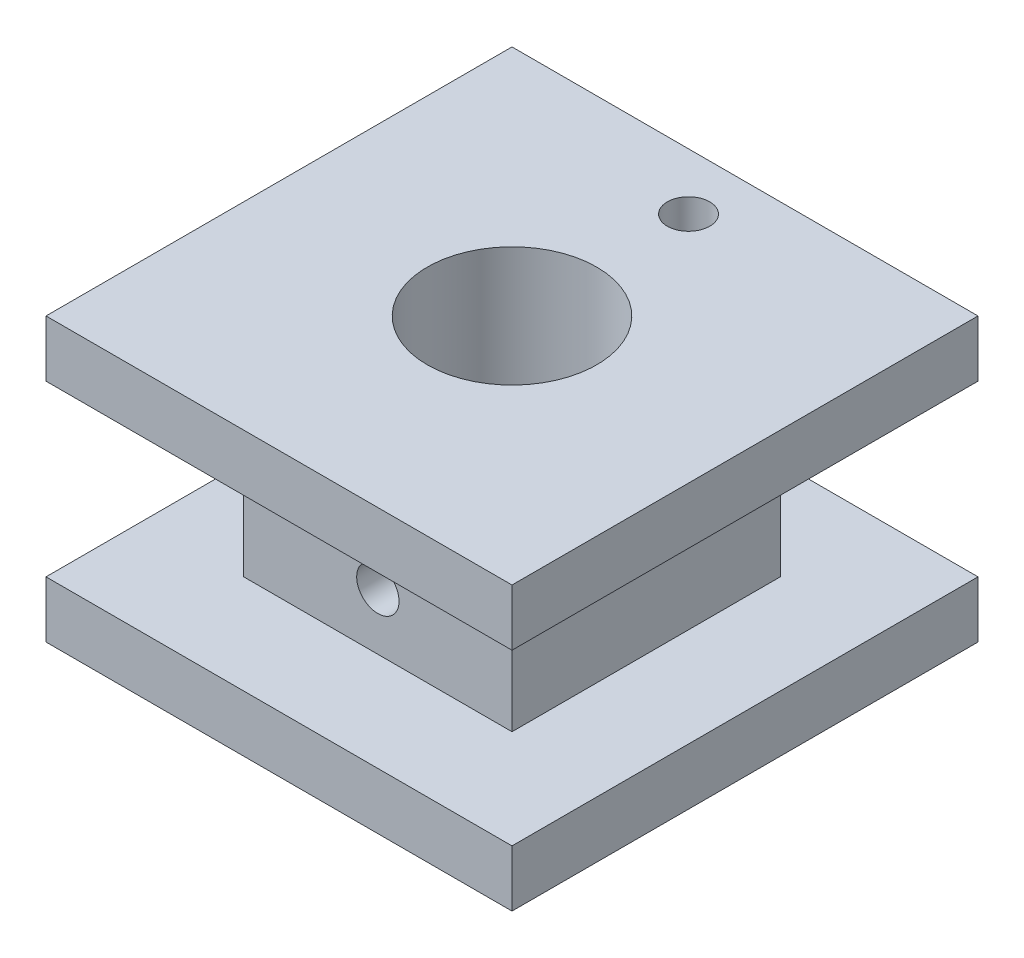
ISO-10303-21;
HEADER;
FILE_DESCRIPTION(('STEP AP214'),'2;1');
FILE_NAME('part.step','',(''),(''),'','','');
FILE_SCHEMA(('AUTOMOTIVE_DESIGN { 1 0 10303 214 1 1 1 1 }'));
ENDSEC;
DATA;
#1=APPLICATION_CONTEXT('core data for automotive mechanical design processes');
#2=APPLICATION_PROTOCOL_DEFINITION('international standard','automotive_design',2000,#1);
#3=PRODUCT_CONTEXT('',#1,'mechanical');
#4=PRODUCT('Part','Part','',(#3));
#5=PRODUCT_RELATED_PRODUCT_CATEGORY('part','',(#4));
#6=PRODUCT_DEFINITION_FORMATION('','',#4);
#7=PRODUCT_DEFINITION_CONTEXT('part definition',#1,'design');
#8=PRODUCT_DEFINITION('design','',#6,#7);
#9=PRODUCT_DEFINITION_SHAPE('','',#8);
#10=(LENGTH_UNIT() NAMED_UNIT(*) SI_UNIT(.MILLI.,.METRE.));
#11=(NAMED_UNIT(*) PLANE_ANGLE_UNIT() SI_UNIT($,.RADIAN.));
#12=(NAMED_UNIT(*) SI_UNIT($,.STERADIAN.) SOLID_ANGLE_UNIT());
#13=UNCERTAINTY_MEASURE_WITH_UNIT(LENGTH_MEASURE(1.E-05),#10,'distance_accuracy_value','');
#14=(GEOMETRIC_REPRESENTATION_CONTEXT(3) GLOBAL_UNCERTAINTY_ASSIGNED_CONTEXT((#13)) GLOBAL_UNIT_ASSIGNED_CONTEXT((#10,
#11,#12)) REPRESENTATION_CONTEXT('',''));
#15=CARTESIAN_POINT('',(0.,0.,0.));
#16=DIRECTION('',(0.,0.,1.));
#17=DIRECTION('',(1.,0.,0.));
#18=AXIS2_PLACEMENT_3D('',#15,#16,#17);
#19=CARTESIAN_POINT('',(-16.5,20.,16.5));
#20=DIRECTION('',(1.,0.,0.));
#21=DIRECTION('',(0.,0.,-1.));
#22=AXIS2_PLACEMENT_3D('',#19,#20,#21);
#23=PLANE('',#22);
#24=DIRECTION('',(0.,-1.,0.));
#25=VECTOR('',#24,1.);
#26=CARTESIAN_POINT('',(-16.5,20.,-16.5));
#27=LINE('',#26,#25);
#28=CARTESIAN_POINT('',(-16.5,20.,-16.5));
#29=VERTEX_POINT('',#28);
#30=CARTESIAN_POINT('',(-16.5,16.,-16.5));
#31=VERTEX_POINT('',#30);
#32=EDGE_CURVE('E210',#29,#31,#27,.T.);
#33=ORIENTED_EDGE('',*,*,#32,.T.);
#34=DIRECTION('',(0.,0.,1.));
#35=VECTOR('',#34,1.);
#36=CARTESIAN_POINT('',(-16.5,16.,9.5));
#37=LINE('',#36,#35);
#38=CARTESIAN_POINT('',(-16.5,16.,16.5));
#39=VERTEX_POINT('',#38);
#40=EDGE_CURVE('E178',#31,#39,#37,.T.);
#41=ORIENTED_EDGE('',*,*,#40,.T.);
#42=DIRECTION('',(0.,-1.,0.));
#43=VECTOR('',#42,1.);
#44=CARTESIAN_POINT('',(-16.5,20.,16.5));
#45=LINE('',#44,#43);
#46=CARTESIAN_POINT('',(-16.5,20.,16.5));
#47=VERTEX_POINT('',#46);
#48=EDGE_CURVE('E206',#47,#39,#45,.T.);
#49=ORIENTED_EDGE('',*,*,#48,.F.);
#50=DIRECTION('',(0.,0.,1.));
#51=VECTOR('',#50,1.);
#52=CARTESIAN_POINT('',(-16.5,20.,16.5));
#53=LINE('',#52,#51);
#54=EDGE_CURVE('E187',#29,#47,#53,.T.);
#55=ORIENTED_EDGE('',*,*,#54,.F.);
#56=EDGE_LOOP('',(#33,#41,#49,#55));
#57=FACE_BOUND('',#56,.T.);
#58=ADVANCED_FACE('F36',(#57),#23,.F.);
#59=DIRECTION('',(0.,0.,1.));
#60=VECTOR('',#59,1.);
#61=CARTESIAN_POINT('',(-16.5,4.,9.5));
#62=LINE('',#61,#60);
#63=CARTESIAN_POINT('',(-16.5,4.,-16.5));
#64=VERTEX_POINT('',#63);
#65=CARTESIAN_POINT('',(-16.5,4.,16.5));
#66=VERTEX_POINT('',#65);
#67=EDGE_CURVE('E176',#64,#66,#62,.T.);
#68=ORIENTED_EDGE('',*,*,#67,.F.);
#69=CARTESIAN_POINT('',(-16.5,0.,-16.5));
#70=VERTEX_POINT('',#69);
#71=EDGE_CURVE('E209',#64,#70,#27,.T.);
#72=ORIENTED_EDGE('',*,*,#71,.T.);
#73=DIRECTION('',(0.,0.,1.));
#74=VECTOR('',#73,1.);
#75=CARTESIAN_POINT('',(-16.5,0.,16.5));
#76=LINE('',#75,#74);
#77=CARTESIAN_POINT('',(-16.5,0.,16.5));
#78=VERTEX_POINT('',#77);
#79=EDGE_CURVE('E197',#70,#78,#76,.T.);
#80=ORIENTED_EDGE('',*,*,#79,.T.);
#81=EDGE_CURVE('E205',#66,#78,#45,.T.);
#82=ORIENTED_EDGE('',*,*,#81,.F.);
#83=EDGE_LOOP('',(#68,#72,#80,#82));
#84=FACE_BOUND('',#83,.T.);
#85=ADVANCED_FACE('F256',(#84),#23,.F.);
#86=CARTESIAN_POINT('',(16.5,20.,16.5));
#87=DIRECTION('',(-1.,0.,0.));
#88=DIRECTION('',(0.,0.,1.));
#89=AXIS2_PLACEMENT_3D('',#86,#87,#88);
#90=PLANE('',#89);
#91=DIRECTION('',(0.,-1.,0.));
#92=VECTOR('',#91,1.);
#93=CARTESIAN_POINT('',(16.5,20.,-16.5));
#94=LINE('',#93,#92);
#95=CARTESIAN_POINT('',(16.5,4.00000000000001,-16.5));
#96=VERTEX_POINT('',#95);
#97=CARTESIAN_POINT('',(16.5,0.,-16.5));
#98=VERTEX_POINT('',#97);
#99=EDGE_CURVE('E50',#96,#98,#94,.T.);
#100=ORIENTED_EDGE('',*,*,#99,.F.);
#101=DIRECTION('',(0.,0.,1.));
#102=VECTOR('',#101,1.);
#103=CARTESIAN_POINT('',(16.5,4.00000000000001,9.5));
#104=LINE('',#103,#102);
#105=CARTESIAN_POINT('',(16.5,4.00000000000001,16.5));
#106=VERTEX_POINT('',#105);
#107=EDGE_CURVE('E173',#96,#106,#104,.T.);
#108=ORIENTED_EDGE('',*,*,#107,.T.);
#109=DIRECTION('',(0.,-1.,0.));
#110=VECTOR('',#109,1.);
#111=CARTESIAN_POINT('',(16.5,20.,16.5));
#112=LINE('',#111,#110);
#113=CARTESIAN_POINT('',(16.5,0.,16.5));
#114=VERTEX_POINT('',#113);
#115=EDGE_CURVE('E191',#106,#114,#112,.T.);
#116=ORIENTED_EDGE('',*,*,#115,.T.);
#117=DIRECTION('',(0.,0.,-1.));
#118=VECTOR('',#117,1.);
#119=CARTESIAN_POINT('',(16.5,0.,16.5));
#120=LINE('',#119,#118);
#121=EDGE_CURVE('E175',#114,#98,#120,.T.);
#122=ORIENTED_EDGE('',*,*,#121,.T.);
#123=EDGE_LOOP('',(#100,#108,#116,#122));
#124=FACE_BOUND('',#123,.T.);
#125=ADVANCED_FACE('F262',(#124),#90,.F.);
#126=DIRECTION('',(0.,0.,1.));
#127=VECTOR('',#126,1.);
#128=CARTESIAN_POINT('',(16.5,16.,9.5));
#129=LINE('',#128,#127);
#130=CARTESIAN_POINT('',(16.5,16.,-16.5));
#131=VERTEX_POINT('',#130);
#132=CARTESIAN_POINT('',(16.5,16.,16.5));
#133=VERTEX_POINT('',#132);
#134=EDGE_CURVE('E168',#131,#133,#129,.T.);
#135=ORIENTED_EDGE('',*,*,#134,.F.);
#136=CARTESIAN_POINT('',(16.5,20.,-16.5));
#137=VERTEX_POINT('',#136);
#138=EDGE_CURVE('E11',#137,#131,#94,.T.);
#139=ORIENTED_EDGE('',*,*,#138,.F.);
#140=DIRECTION('',(0.,0.,-1.));
#141=VECTOR('',#140,1.);
#142=CARTESIAN_POINT('',(16.5,20.,16.5));
#143=LINE('',#142,#141);
#144=CARTESIAN_POINT('',(16.5,20.,16.5));
#145=VERTEX_POINT('',#144);
#146=EDGE_CURVE('E181',#145,#137,#143,.T.);
#147=ORIENTED_EDGE('',*,*,#146,.F.);
#148=EDGE_CURVE('E202',#145,#133,#112,.T.);
#149=ORIENTED_EDGE('',*,*,#148,.T.);
#150=EDGE_LOOP('',(#135,#139,#147,#149));
#151=FACE_BOUND('',#150,.T.);
#152=ADVANCED_FACE('F38',(#151),#90,.F.);
#153=CARTESIAN_POINT('',(-16.5,20.,-16.5));
#154=DIRECTION('',(0.,0.,1.));
#155=DIRECTION('',(1.,0.,0.));
#156=AXIS2_PLACEMENT_3D('',#153,#154,#155);
#157=PLANE('',#156);
#158=DIRECTION('',(-1.,0.,0.));
#159=VECTOR('',#158,1.);
#160=CARTESIAN_POINT('',(-16.5,16.,-16.5));
#161=LINE('',#160,#159);
#162=EDGE_CURVE('E150',#131,#31,#161,.T.);
#163=ORIENTED_EDGE('',*,*,#162,.T.);
#164=ORIENTED_EDGE('',*,*,#32,.F.);
#165=DIRECTION('',(-1.,0.,0.));
#166=VECTOR('',#165,1.);
#167=CARTESIAN_POINT('',(-16.5,20.,-16.5));
#168=LINE('',#167,#166);
#169=EDGE_CURVE('E184',#137,#29,#168,.T.);
#170=ORIENTED_EDGE('',*,*,#169,.F.);
#171=ORIENTED_EDGE('',*,*,#138,.T.);
#172=EDGE_LOOP('',(#163,#164,#170,#171));
#173=FACE_BOUND('',#172,.T.);
#174=ADVANCED_FACE('F267',(#173),#157,.F.);
#175=DIRECTION('',(1.,0.,0.));
#176=VECTOR('',#175,1.);
#177=CARTESIAN_POINT('',(-16.5,4.,-16.5));
#178=LINE('',#177,#176);
#179=EDGE_CURVE('E155',#64,#96,#178,.T.);
#180=ORIENTED_EDGE('',*,*,#179,.T.);
#181=ORIENTED_EDGE('',*,*,#99,.T.);
#182=DIRECTION('',(-1.,0.,0.));
#183=VECTOR('',#182,1.);
#184=CARTESIAN_POINT('',(-16.5,0.,-16.5));
#185=LINE('',#184,#183);
#186=EDGE_CURVE('E194',#98,#70,#185,.T.);
#187=ORIENTED_EDGE('',*,*,#186,.T.);
#188=ORIENTED_EDGE('',*,*,#71,.F.);
#189=EDGE_LOOP('',(#180,#181,#187,#188));
#190=FACE_BOUND('',#189,.T.);
#191=ADVANCED_FACE('F269',(#190),#157,.F.);
#192=CARTESIAN_POINT('',(-16.5,20.,16.5));
#193=DIRECTION('',(0.,0.,-1.));
#194=DIRECTION('',(-1.,0.,0.));
#195=AXIS2_PLACEMENT_3D('',#192,#193,#194);
#196=PLANE('',#195);
#197=ORIENTED_EDGE('',*,*,#115,.F.);
#198=DIRECTION('',(1.,0.,0.));
#199=VECTOR('',#198,1.);
#200=CARTESIAN_POINT('',(-16.5,4.,16.5));
#201=LINE('',#200,#199);
#202=EDGE_CURVE('E166',#66,#106,#201,.T.);
#203=ORIENTED_EDGE('',*,*,#202,.F.);
#204=ORIENTED_EDGE('',*,*,#81,.T.);
#205=DIRECTION('',(1.,0.,0.));
#206=VECTOR('',#205,1.);
#207=CARTESIAN_POINT('',(-16.5,0.,16.5));
#208=LINE('',#207,#206);
#209=EDGE_CURVE('E185',#78,#114,#208,.T.);
#210=ORIENTED_EDGE('',*,*,#209,.T.);
#211=EDGE_LOOP('',(#197,#203,#204,#210));
#212=FACE_BOUND('',#211,.T.);
#213=ADVANCED_FACE('F275',(#212),#196,.F.);
#214=ORIENTED_EDGE('',*,*,#48,.T.);
#215=DIRECTION('',(-1.,0.,0.));
#216=VECTOR('',#215,1.);
#217=CARTESIAN_POINT('',(-16.5,16.,16.5));
#218=LINE('',#217,#216);
#219=EDGE_CURVE('E152',#133,#39,#218,.T.);
#220=ORIENTED_EDGE('',*,*,#219,.F.);
#221=ORIENTED_EDGE('',*,*,#148,.F.);
#222=DIRECTION('',(1.,0.,0.));
#223=VECTOR('',#222,1.);
#224=CARTESIAN_POINT('',(-16.5,20.,16.5));
#225=LINE('',#224,#223);
#226=EDGE_CURVE('E189',#47,#145,#225,.T.);
#227=ORIENTED_EDGE('',*,*,#226,.F.);
#228=EDGE_LOOP('',(#214,#220,#221,#227));
#229=FACE_BOUND('',#228,.T.);
#230=ADVANCED_FACE('F265',(#229),#196,.F.);
#231=CARTESIAN_POINT('',(0.,20.,0.));
#232=DIRECTION('',(0.,-1.,0.));
#233=DIRECTION('',(0.,0.,-1.));
#234=AXIS2_PLACEMENT_3D('',#231,#232,#233);
#235=PLANE('',#234);
#236=CARTESIAN_POINT('',(0.,20.,-12.5));
#237=DIRECTION('',(0.,-1.,0.));
#238=DIRECTION('',(0.,0.,-1.));
#239=AXIS2_PLACEMENT_3D('',#236,#237,#238);
#240=CIRCLE('',#239,1.5);
#241=CARTESIAN_POINT('',(0.,20.,-14.));
#242=VERTEX_POINT('',#241);
#243=EDGE_CURVE('E214',#242,#242,#240,.T.);
#244=ORIENTED_EDGE('',*,*,#243,.T.);
#245=EDGE_LOOP('',(#244));
#246=FACE_BOUND('',#245,.T.);
#247=CARTESIAN_POINT('',(0.,20.,0.));
#248=DIRECTION('',(0.,1.,0.));
#249=DIRECTION('',(0.,0.,1.));
#250=AXIS2_PLACEMENT_3D('',#247,#248,#249);
#251=CIRCLE('',#250,6.);
#252=CARTESIAN_POINT('',(0.,20.,6.));
#253=VERTEX_POINT('',#252);
#254=EDGE_CURVE('E219',#253,#253,#251,.T.);
#255=ORIENTED_EDGE('',*,*,#254,.F.);
#256=EDGE_LOOP('',(#255));
#257=FACE_BOUND('',#256,.T.);
#258=ORIENTED_EDGE('',*,*,#146,.T.);
#259=ORIENTED_EDGE('',*,*,#169,.T.);
#260=ORIENTED_EDGE('',*,*,#54,.T.);
#261=ORIENTED_EDGE('',*,*,#226,.T.);
#262=EDGE_LOOP('',(#258,#259,#260,#261));
#263=FACE_BOUND('',#262,.T.);
#264=ADVANCED_FACE('F285',(#246,#257,#263),#235,.F.);
#265=CARTESIAN_POINT('',(0.,0.,0.));
#266=DIRECTION('',(0.,-1.,0.));
#267=DIRECTION('',(0.,0.,-1.));
#268=AXIS2_PLACEMENT_3D('',#265,#266,#267);
#269=PLANE('',#268);
#270=CARTESIAN_POINT('',(0.,0.,0.));
#271=DIRECTION('',(0.,1.,0.));
#272=DIRECTION('',(0.,0.,1.));
#273=AXIS2_PLACEMENT_3D('',#270,#271,#272);
#274=CIRCLE('',#273,6.);
#275=CARTESIAN_POINT('',(0.,0.,6.));
#276=VERTEX_POINT('',#275);
#277=EDGE_CURVE('E143',#276,#276,#274,.T.);
#278=ORIENTED_EDGE('',*,*,#277,.T.);
#279=EDGE_LOOP('',(#278));
#280=FACE_BOUND('',#279,.T.);
#281=ORIENTED_EDGE('',*,*,#121,.F.);
#282=ORIENTED_EDGE('',*,*,#209,.F.);
#283=ORIENTED_EDGE('',*,*,#79,.F.);
#284=ORIENTED_EDGE('',*,*,#186,.F.);
#285=EDGE_LOOP('',(#281,#282,#283,#284));
#286=FACE_BOUND('',#285,.T.);
#287=ADVANCED_FACE('F295',(#280,#286),#269,.T.);
#288=CARTESIAN_POINT('',(-16.5,4.,9.5));
#289=DIRECTION('',(0.,-1.,0.));
#290=DIRECTION('',(1.,0.,0.));
#291=AXIS2_PLACEMENT_3D('',#288,#289,#290);
#292=PLANE('',#291);
#293=ORIENTED_EDGE('',*,*,#67,.T.);
#294=ORIENTED_EDGE('',*,*,#202,.T.);
#295=ORIENTED_EDGE('',*,*,#107,.F.);
#296=ORIENTED_EDGE('',*,*,#179,.F.);
#297=EDGE_LOOP('',(#293,#294,#295,#296));
#298=FACE_BOUND('',#297,.T.);
#299=DIRECTION('',(1.,0.,0.));
#300=VECTOR('',#299,1.);
#301=CARTESIAN_POINT('',(-16.5,4.,9.5));
#302=LINE('',#301,#300);
#303=CARTESIAN_POINT('',(-9.5,4.,9.5));
#304=VERTEX_POINT('',#303);
#305=CARTESIAN_POINT('',(9.5,4.,9.5));
#306=VERTEX_POINT('',#305);
#307=EDGE_CURVE('E134',#304,#306,#302,.T.);
#308=ORIENTED_EDGE('',*,*,#307,.F.);
#309=DIRECTION('',(0.,0.,-1.));
#310=VECTOR('',#309,1.);
#311=CARTESIAN_POINT('',(-9.5,4.,9.5));
#312=LINE('',#311,#310);
#313=CARTESIAN_POINT('',(-9.5,4.,-9.5));
#314=VERTEX_POINT('',#313);
#315=EDGE_CURVE('E132',#304,#314,#312,.T.);
#316=ORIENTED_EDGE('',*,*,#315,.T.);
#317=DIRECTION('',(1.,0.,0.));
#318=VECTOR('',#317,1.);
#319=CARTESIAN_POINT('',(-16.5,4.,-9.5));
#320=LINE('',#319,#318);
#321=CARTESIAN_POINT('',(9.5,4.00000000000001,-9.5));
#322=VERTEX_POINT('',#321);
#323=EDGE_CURVE('E66',#314,#322,#320,.T.);
#324=ORIENTED_EDGE('',*,*,#323,.T.);
#325=DIRECTION('',(0.,0.,-1.));
#326=VECTOR('',#325,1.);
#327=CARTESIAN_POINT('',(9.5,4.,9.5));
#328=LINE('',#327,#326);
#329=EDGE_CURVE('E158',#306,#322,#328,.T.);
#330=ORIENTED_EDGE('',*,*,#329,.F.);
#331=EDGE_LOOP('',(#308,#316,#324,#330));
#332=FACE_BOUND('',#331,.T.);
#333=ADVANCED_FACE('F133',(#298,#332),#292,.F.);
#334=CARTESIAN_POINT('',(-16.5,16.,9.5));
#335=DIRECTION('',(0.,1.,0.));
#336=DIRECTION('',(-1.,0.,0.));
#337=AXIS2_PLACEMENT_3D('',#334,#335,#336);
#338=PLANE('',#337);
#339=CARTESIAN_POINT('',(0.,16.,-12.5));
#340=DIRECTION('',(0.,1.,0.));
#341=DIRECTION('',(-1.,0.,0.));
#342=AXIS2_PLACEMENT_3D('',#339,#340,#341);
#343=CIRCLE('',#342,1.5);
#344=CARTESIAN_POINT('',(-1.5,16.,-12.5));
#345=VERTEX_POINT('',#344);
#346=EDGE_CURVE('E212',#345,#345,#343,.T.);
#347=ORIENTED_EDGE('',*,*,#346,.T.);
#348=EDGE_LOOP('',(#347));
#349=FACE_BOUND('',#348,.T.);
#350=DIRECTION('',(0.,0.,1.));
#351=VECTOR('',#350,1.);
#352=CARTESIAN_POINT('',(-9.5,16.,9.5));
#353=LINE('',#352,#351);
#354=CARTESIAN_POINT('',(-9.5,16.,-9.5));
#355=VERTEX_POINT('',#354);
#356=CARTESIAN_POINT('',(-9.5,16.,9.5));
#357=VERTEX_POINT('',#356);
#358=EDGE_CURVE('E58',#355,#357,#353,.T.);
#359=ORIENTED_EDGE('',*,*,#358,.T.);
#360=DIRECTION('',(-1.,0.,0.));
#361=VECTOR('',#360,1.);
#362=CARTESIAN_POINT('',(-16.5,16.,9.5));
#363=LINE('',#362,#361);
#364=CARTESIAN_POINT('',(9.5,16.,9.5));
#365=VERTEX_POINT('',#364);
#366=EDGE_CURVE('E163',#365,#357,#363,.T.);
#367=ORIENTED_EDGE('',*,*,#366,.F.);
#368=DIRECTION('',(0.,0.,1.));
#369=VECTOR('',#368,1.);
#370=CARTESIAN_POINT('',(9.5,16.,9.5));
#371=LINE('',#370,#369);
#372=CARTESIAN_POINT('',(9.5,16.,-9.5));
#373=VERTEX_POINT('',#372);
#374=EDGE_CURVE('E234',#373,#365,#371,.T.);
#375=ORIENTED_EDGE('',*,*,#374,.F.);
#376=DIRECTION('',(-1.,0.,0.));
#377=VECTOR('',#376,1.);
#378=CARTESIAN_POINT('',(-16.5,16.,-9.5));
#379=LINE('',#378,#377);
#380=EDGE_CURVE('E149',#373,#355,#379,.T.);
#381=ORIENTED_EDGE('',*,*,#380,.T.);
#382=EDGE_LOOP('',(#359,#367,#375,#381));
#383=FACE_BOUND('',#382,.T.);
#384=ORIENTED_EDGE('',*,*,#219,.T.);
#385=ORIENTED_EDGE('',*,*,#40,.F.);
#386=ORIENTED_EDGE('',*,*,#162,.F.);
#387=ORIENTED_EDGE('',*,*,#134,.T.);
#388=EDGE_LOOP('',(#384,#385,#386,#387));
#389=FACE_BOUND('',#388,.T.);
#390=ADVANCED_FACE('F241',(#349,#383,#389),#338,.F.);
#391=CARTESIAN_POINT('',(0.,0.,9.5));
#392=DIRECTION('',(0.,0.,-1.));
#393=DIRECTION('',(-1.,0.,0.));
#394=AXIS2_PLACEMENT_3D('',#391,#392,#393);
#395=PLANE('',#394);
#396=CARTESIAN_POINT('',(0.,8.,9.5));
#397=DIRECTION('',(0.,0.,-1.));
#398=DIRECTION('',(-1.,0.,0.));
#399=AXIS2_PLACEMENT_3D('',#396,#397,#398);
#400=CIRCLE('',#399,1.5);
#401=CARTESIAN_POINT('',(-1.5,8.,9.5));
#402=VERTEX_POINT('',#401);
#403=EDGE_CURVE('E215',#402,#402,#400,.T.);
#404=ORIENTED_EDGE('',*,*,#403,.T.);
#405=EDGE_LOOP('',(#404));
#406=FACE_BOUND('',#405,.T.);
#407=ORIENTED_EDGE('',*,*,#366,.T.);
#408=DIRECTION('',(0.,-1.,0.));
#409=VECTOR('',#408,1.);
#410=CARTESIAN_POINT('',(-9.5,4.,9.5));
#411=LINE('',#410,#409);
#412=EDGE_CURVE('E136',#357,#304,#411,.T.);
#413=ORIENTED_EDGE('',*,*,#412,.T.);
#414=ORIENTED_EDGE('',*,*,#307,.T.);
#415=DIRECTION('',(0.,-1.,0.));
#416=VECTOR('',#415,1.);
#417=CARTESIAN_POINT('',(9.5,4.,9.5));
#418=LINE('',#417,#416);
#419=EDGE_CURVE('E235',#365,#306,#418,.T.);
#420=ORIENTED_EDGE('',*,*,#419,.F.);
#421=EDGE_LOOP('',(#407,#413,#414,#420));
#422=FACE_BOUND('',#421,.T.);
#423=ADVANCED_FACE('F245',(#406,#422),#395,.F.);
#424=CARTESIAN_POINT('',(0.,0.,-9.5));
#425=DIRECTION('',(0.,0.,1.));
#426=DIRECTION('',(-1.,0.,0.));
#427=AXIS2_PLACEMENT_3D('',#424,#425,#426);
#428=PLANE('',#427);
#429=ORIENTED_EDGE('',*,*,#323,.F.);
#430=DIRECTION('',(0.,1.,0.));
#431=VECTOR('',#430,1.);
#432=CARTESIAN_POINT('',(-9.5,4.,-9.5));
#433=LINE('',#432,#431);
#434=EDGE_CURVE('E137',#314,#355,#433,.T.);
#435=ORIENTED_EDGE('',*,*,#434,.T.);
#436=ORIENTED_EDGE('',*,*,#380,.F.);
#437=DIRECTION('',(0.,1.,0.));
#438=VECTOR('',#437,1.);
#439=CARTESIAN_POINT('',(9.5,4.,-9.5));
#440=LINE('',#439,#438);
#441=EDGE_CURVE('E148',#322,#373,#440,.T.);
#442=ORIENTED_EDGE('',*,*,#441,.F.);
#443=EDGE_LOOP('',(#429,#435,#436,#442));
#444=FACE_BOUND('',#443,.T.);
#445=ADVANCED_FACE('F146',(#444),#428,.F.);
#446=CARTESIAN_POINT('',(9.5,0.,0.));
#447=DIRECTION('',(-1.,0.,0.));
#448=DIRECTION('',(0.,0.,1.));
#449=AXIS2_PLACEMENT_3D('',#446,#447,#448);
#450=PLANE('',#449);
#451=ORIENTED_EDGE('',*,*,#441,.T.);
#452=ORIENTED_EDGE('',*,*,#374,.T.);
#453=ORIENTED_EDGE('',*,*,#419,.T.);
#454=ORIENTED_EDGE('',*,*,#329,.T.);
#455=EDGE_LOOP('',(#451,#452,#453,#454));
#456=FACE_BOUND('',#455,.T.);
#457=ADVANCED_FACE('F239',(#456),#450,.F.);
#458=CARTESIAN_POINT('',(-9.5,0.,0.));
#459=DIRECTION('',(1.,0.,0.));
#460=DIRECTION('',(0.,0.,1.));
#461=AXIS2_PLACEMENT_3D('',#458,#459,#460);
#462=PLANE('',#461);
#463=ORIENTED_EDGE('',*,*,#434,.F.);
#464=ORIENTED_EDGE('',*,*,#315,.F.);
#465=ORIENTED_EDGE('',*,*,#412,.F.);
#466=ORIENTED_EDGE('',*,*,#358,.F.);
#467=EDGE_LOOP('',(#463,#464,#465,#466));
#468=FACE_BOUND('',#467,.T.);
#469=ADVANCED_FACE('F139',(#468),#462,.F.);
#470=CARTESIAN_POINT('',(0.,0.,0.));
#471=DIRECTION('',(0.,1.,0.));
#472=DIRECTION('',(0.,0.,1.));
#473=AXIS2_PLACEMENT_3D('',#470,#471,#472);
#474=CYLINDRICAL_SURFACE('',#473,6.);
#475=CARTESIAN_POINT('',(0.,6.5,6.));
#476=CARTESIAN_POINT('',(0.0828760886697311,6.50000232573816,5.99999859868013));
#477=CARTESIAN_POINT('',(0.165778157830763,6.50689155077379,5.99826578131828));
#478=CARTESIAN_POINT('',(0.329206323770533,6.53422515130701,5.99152113829892));
#479=CARTESIAN_POINT('',(0.409731046870739,6.55467720953785,5.98650745419968));
#480=CARTESIAN_POINT('',(0.566020872182577,6.60843925346209,5.9737562633204));
#481=CARTESIAN_POINT('',(0.641791563430003,6.64173379871528,5.96602202842087));
#482=CARTESIAN_POINT('',(0.786672131904427,6.72018139004484,5.94865343807593));
#483=CARTESIAN_POINT('',(0.855781784348759,6.76533483611894,5.9390190185405));
#484=CARTESIAN_POINT('',(0.98680192730092,6.86720078965421,5.91867413591801));
#485=CARTESIAN_POINT('',(1.04855569006107,6.92411157495918,5.90794707148533));
#486=CARTESIAN_POINT('',(1.16174892720331,7.04745220490892,5.8867362011753));
#487=CARTESIAN_POINT('',(1.21318723694914,7.1138831229465,5.87625242288348));
#488=CARTESIAN_POINT('',(1.30502654279903,7.25559522673744,5.8565477569971));
#489=CARTESIAN_POINT('',(1.34525221592536,7.33099323081041,5.84734794470605));
#490=CARTESIAN_POINT('',(1.41239690855053,7.48774841165836,5.83149494812223));
#491=CARTESIAN_POINT('',(1.43931805543933,7.56910463332576,5.82484135672789));
#492=CARTESIAN_POINT('',(1.47855483680429,7.73374349820248,5.81500476717551));
#493=CARTESIAN_POINT('',(1.49115226833334,7.8169548960498,5.81175491075426));
#494=CARTESIAN_POINT('',(1.50226177506785,7.98436856901398,5.80889362537741));
#495=CARTESIAN_POINT('',(1.50077614181798,8.06857068069861,5.80928160448644));
#496=CARTESIAN_POINT('',(1.48398652463928,8.23341580774448,5.81359205496618));
#497=CARTESIAN_POINT('',(1.46901834019052,8.3140956214651,5.81742863001879));
#498=CARTESIAN_POINT('',(1.42622418690311,8.47176105091129,5.82806709676484));
#499=CARTESIAN_POINT('',(1.39839730206943,8.54874640302898,5.83486919970696));
#500=CARTESIAN_POINT('',(1.33038947793716,8.69773801625207,5.85075113904187));
#501=CARTESIAN_POINT('',(1.29008666723291,8.76968617178955,5.85985327469421));
#502=CARTESIAN_POINT('',(1.19835627601496,8.90591870975684,5.87929710846386));
#503=CARTESIAN_POINT('',(1.14692674880884,8.97020174806726,5.88963902334735));
#504=CARTESIAN_POINT('',(1.03266342468122,9.0912036156944,5.91075880539781));
#505=CARTESIAN_POINT('',(0.969546258165861,9.14765449006135,5.92154069477971));
#506=CARTESIAN_POINT('',(0.834611917503702,9.24922124246391,5.94205965578786));
#507=CARTESIAN_POINT('',(0.762794477707946,9.29433677426357,5.95179669549415));
#508=CARTESIAN_POINT('',(0.612115888681394,9.37205058622439,5.96917732094183));
#509=CARTESIAN_POINT('',(0.533231393208626,9.40460534025443,5.97681360127725));
#510=CARTESIAN_POINT('',(0.370876008142885,9.45591730570957,5.98907916991419));
#511=CARTESIAN_POINT('',(0.287405999150486,9.47467715641814,5.99370903339281));
#512=CARTESIAN_POINT('',(0.120539970390028,9.49745756555884,5.99935499271375));
#513=CARTESIAN_POINT('',(0.0371967199882113,9.5018430260753,6.00046053508279));
#514=CARTESIAN_POINT('',(-0.129032874801506,9.49675099794452,5.99918804814451));
#515=CARTESIAN_POINT('',(-0.211919259644593,9.48727475720087,5.99681033241847));
#516=CARTESIAN_POINT('',(-0.37361426877649,9.45502909160862,5.98889581127357));
#517=CARTESIAN_POINT('',(-0.452465118968752,9.43245873652302,5.98340634185811));
#518=CARTESIAN_POINT('',(-0.605257292452509,9.37489291597156,5.96988706634134));
#519=CARTESIAN_POINT('',(-0.679198119032632,9.33989619568683,5.96185700369892));
#520=CARTESIAN_POINT('',(-0.821523134429845,9.25776387112528,5.9439330792631));
#521=CARTESIAN_POINT('',(-0.889785441835829,9.21042388760324,5.93400867366932));
#522=CARTESIAN_POINT('',(-1.01752661364324,9.10521009120303,5.91344509187419));
#523=CARTESIAN_POINT('',(-1.07700395897301,9.04733446038309,5.90280579251705));
#524=CARTESIAN_POINT('',(-1.18699056807273,8.92099803915554,5.88168956960771));
#525=CARTESIAN_POINT('',(-1.23724386762203,8.85231229699758,5.87122304187281));
#526=CARTESIAN_POINT('',(-1.3255107590127,8.70726736553429,5.85192878377239));
#527=CARTESIAN_POINT('',(-1.36352489415794,8.63090851704025,5.84310098067026));
#528=CARTESIAN_POINT('',(-1.42595142060929,8.47309427758692,5.82818094734665));
#529=CARTESIAN_POINT('',(-1.45044439665406,8.39167237165599,5.82207255291906));
#530=CARTESIAN_POINT('',(-1.48534565995378,8.22569036211089,5.81326744090184));
#531=CARTESIAN_POINT('',(-1.49575702747866,8.14113094896751,5.81056997719936));
#532=CARTESIAN_POINT('',(-1.50203859033399,7.9738789761448,5.80894901203957));
#533=CARTESIAN_POINT('',(-1.49831789778012,7.89120256487527,5.80991932728264));
#534=CARTESIAN_POINT('',(-1.47737727831287,7.72769611133202,5.81527909007843));
#535=CARTESIAN_POINT('',(-1.46015762268677,7.64686603198635,5.81966846891857));
#536=CARTESIAN_POINT('',(-1.41293131944279,7.4897915409346,5.83131260682723));
#537=CARTESIAN_POINT('',(-1.38300140468037,7.41352269475979,5.8385501523631));
#538=CARTESIAN_POINT('',(-1.31126491360507,7.26703461728631,5.85507755724829));
#539=CARTESIAN_POINT('',(-1.26945669003419,7.19681622681309,5.86436770120773));
#540=CARTESIAN_POINT('',(-1.17386774863714,7.06244537099798,5.88425634263512));
#541=CARTESIAN_POINT('',(-1.11980316291225,6.99849892657604,5.89488264831757));
#542=CARTESIAN_POINT('',(-1.00178937118974,6.88045295520459,5.91608027246286));
#543=CARTESIAN_POINT('',(-0.937837821261146,6.82635576988703,5.9266515772706));
#544=CARTESIAN_POINT('',(-0.800467586702591,6.7285886914354,5.94677655647663));
#545=CARTESIAN_POINT('',(-0.726898422316388,6.68512538632842,5.95630833365868));
#546=CARTESIAN_POINT('',(-0.573266059510477,6.61125253705947,5.97304924975118));
#547=CARTESIAN_POINT('',(-0.49320756343674,6.58083363935147,5.98026005199781));
#548=CARTESIAN_POINT('',(-0.344410253243472,6.53842816967035,5.99048059565542));
#549=CARTESIAN_POINT('',(-0.276380170908069,6.52404875694657,5.99402585052691));
#550=CARTESIAN_POINT('',(-0.138906071536283,6.50483405637806,5.99878605231948));
#551=CARTESIAN_POINT('',(-0.0694621612426163,6.4999980506947,6.00000117450894));
#552=CARTESIAN_POINT('',(0.,6.5,6.));
#553=B_SPLINE_CURVE_WITH_KNOTS('',3,(#475,#476,#477,#478,#479,#480,#481,#482,#483,#484,#485,
#486,#487,#488,#489,#490,#491,#492,#493,#494,#495,#496,#497,#498,#499,#500,#501,#502,#503,#504,
#505,#506,#507,#508,#509,#510,#511,#512,#513,#514,#515,#516,#517,#518,#519,#520,#521,#522,#523,
#524,#525,#526,#527,#528,#529,#530,#531,#532,#533,#534,#535,#536,#537,#538,#539,#540,#541,#542,
#543,#544,#545,#546,#547,#548,#549,#550,#551,#552),.UNSPECIFIED.,.T.,.F.,(4,2,2,2,2,2,2,2,2,2,2,
2,2,2,2,2,2,2,2,2,2,2,2,2,2,2,2,2,2,2,2,2,2,2,2,2,2,2,4),(0.,0.24837371247189,0.4968882377639,
0.745104902286106,0.993329940169328,1.24614435437139,1.49898729580062,1.75558647545807,
2.01214461169368,2.2635629509943,2.51494038112697,2.76022497007018,3.00552703466038,
3.25330527873879,3.50112690836163,3.75601500969019,4.01091089558247,4.26668229009114,
4.52240473688643,4.77158308949276,5.02073901112743,5.26620274514037,5.51169127322291,
5.76153587565352,6.01142363008019,6.26744509204476,6.52345518749508,6.77792254614036,
7.03233423252408,7.27943780398613,7.52653640956034,7.77216400559447,8.01782568136901,
8.2698957640991,8.52202569770417,8.77872185499588,9.0352336382135,9.24342242942149,
9.45159556043039),.UNSPECIFIED.);
#554=CARTESIAN_POINT('',(0.,6.5,6.));
#555=VERTEX_POINT('',#554);
#556=EDGE_CURVE('E40',#555,#555,#553,.T.);
#557=ORIENTED_EDGE('',*,*,#556,.T.);
#558=EDGE_LOOP('',(#557));
#559=FACE_BOUND('',#558,.T.);
#560=ORIENTED_EDGE('',*,*,#277,.F.);
#561=EDGE_LOOP('',(#560));
#562=FACE_BOUND('',#561,.T.);
#563=ORIENTED_EDGE('',*,*,#254,.T.);
#564=EDGE_LOOP('',(#563));
#565=FACE_BOUND('',#564,.T.);
#566=ADVANCED_FACE('F321',(#559,#562,#565),#474,.F.);
#567=CARTESIAN_POINT('',(0.,12.5,-12.5));
#568=DIRECTION('',(0.,1.,0.));
#569=DIRECTION('',(0.,0.,1.));
#570=AXIS2_PLACEMENT_3D('',#567,#568,#569);
#571=CYLINDRICAL_SURFACE('',#570,1.5);
#572=ORIENTED_EDGE('',*,*,#346,.F.);
#573=EDGE_LOOP('',(#572));
#574=FACE_BOUND('',#573,.T.);
#575=ORIENTED_EDGE('',*,*,#243,.F.);
#576=EDGE_LOOP('',(#575));
#577=FACE_BOUND('',#576,.T.);
#578=ADVANCED_FACE('F324',(#574,#577),#571,.F.);
#579=CARTESIAN_POINT('',(0.,8.,5.5));
#580=DIRECTION('',(0.,0.,1.));
#581=DIRECTION('',(1.,0.,0.));
#582=AXIS2_PLACEMENT_3D('',#579,#580,#581);
#583=CYLINDRICAL_SURFACE('',#582,1.5);
#584=ORIENTED_EDGE('',*,*,#556,.F.);
#585=EDGE_LOOP('',(#584));
#586=FACE_BOUND('',#585,.T.);
#587=ORIENTED_EDGE('',*,*,#403,.F.);
#588=EDGE_LOOP('',(#587));
#589=FACE_BOUND('',#588,.T.);
#590=ADVANCED_FACE('F332',(#586,#589),#583,.F.);
#591=CLOSED_SHELL('',(#58,#85,#125,#152,#174,#191,#213,#230,#264,#287,#333,#390,#423,#445,#457,
#469,#566,#578,#590));
#592=MANIFOLD_SOLID_BREP('B2',#591);
#593=ADVANCED_BREP_SHAPE_REPRESENTATION('',(#18,#592),#14);
#594=SHAPE_DEFINITION_REPRESENTATION(#9,#593);
ENDSEC;
END-ISO-10303-21;
